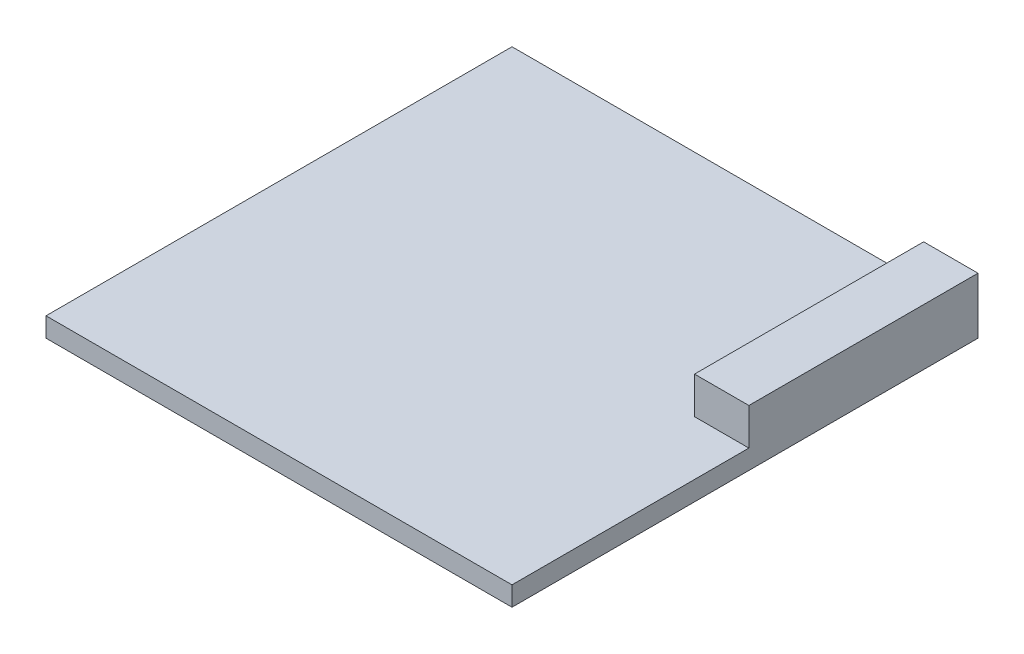
ISO-10303-21;
HEADER;
FILE_DESCRIPTION(('STEP AP214'),'2;1');
FILE_NAME('part.step','',(''),(''),'','','');
FILE_SCHEMA(('AUTOMOTIVE_DESIGN { 1 0 10303 214 1 1 1 1 }'));
ENDSEC;
DATA;
#1=APPLICATION_CONTEXT('core data for automotive mechanical design processes');
#2=APPLICATION_PROTOCOL_DEFINITION('international standard','automotive_design',2000,#1);
#3=PRODUCT_CONTEXT('',#1,'mechanical');
#4=PRODUCT('Part','Part','',(#3));
#5=PRODUCT_RELATED_PRODUCT_CATEGORY('part','',(#4));
#6=PRODUCT_DEFINITION_FORMATION('','',#4);
#7=PRODUCT_DEFINITION_CONTEXT('part definition',#1,'design');
#8=PRODUCT_DEFINITION('design','',#6,#7);
#9=PRODUCT_DEFINITION_SHAPE('','',#8);
#10=(LENGTH_UNIT() NAMED_UNIT(*) SI_UNIT(.MILLI.,.METRE.));
#11=(NAMED_UNIT(*) PLANE_ANGLE_UNIT() SI_UNIT($,.RADIAN.));
#12=(NAMED_UNIT(*) SI_UNIT($,.STERADIAN.) SOLID_ANGLE_UNIT());
#13=UNCERTAINTY_MEASURE_WITH_UNIT(LENGTH_MEASURE(1.E-05),#10,'distance_accuracy_value','');
#14=(GEOMETRIC_REPRESENTATION_CONTEXT(3) GLOBAL_UNCERTAINTY_ASSIGNED_CONTEXT((#13)) GLOBAL_UNIT_ASSIGNED_CONTEXT((#10,
#11,#12)) REPRESENTATION_CONTEXT('',''));
#15=CARTESIAN_POINT('',(0.,0.,0.));
#16=DIRECTION('',(0.,0.,1.));
#17=DIRECTION('',(1.,0.,0.));
#18=AXIS2_PLACEMENT_3D('',#15,#16,#17);
#19=CARTESIAN_POINT('',(-304.8,12.7,304.8));
#20=DIRECTION('',(1.,0.,0.));
#21=DIRECTION('',(0.,0.,-1.));
#22=AXIS2_PLACEMENT_3D('',#19,#20,#21);
#23=PLANE('',#22);
#24=DIRECTION('',(0.,0.,1.));
#25=VECTOR('',#24,1.);
#26=CARTESIAN_POINT('',(-304.8,-12.7,304.8));
#27=LINE('',#26,#25);
#28=CARTESIAN_POINT('',(-304.8,-12.7,-304.8));
#29=VERTEX_POINT('',#28);
#30=CARTESIAN_POINT('',(-304.8,-12.7,304.8));
#31=VERTEX_POINT('',#30);
#32=EDGE_CURVE('E146',#29,#31,#27,.T.);
#33=ORIENTED_EDGE('',*,*,#32,.T.);
#34=DIRECTION('',(0.,-1.,0.));
#35=VECTOR('',#34,1.);
#36=CARTESIAN_POINT('',(-304.8,12.7,304.8));
#37=LINE('',#36,#35);
#38=CARTESIAN_POINT('',(-304.8,12.7,304.8));
#39=VERTEX_POINT('',#38);
#40=EDGE_CURVE('E11',#39,#31,#37,.T.);
#41=ORIENTED_EDGE('',*,*,#40,.F.);
#42=DIRECTION('',(0.,0.,1.));
#43=VECTOR('',#42,1.);
#44=CARTESIAN_POINT('',(-304.8,12.7,304.8));
#45=LINE('',#44,#43);
#46=CARTESIAN_POINT('',(-304.8,12.7,-304.8));
#47=VERTEX_POINT('',#46);
#48=EDGE_CURVE('E147',#47,#39,#45,.T.);
#49=ORIENTED_EDGE('',*,*,#48,.F.);
#50=DIRECTION('',(0.,-1.,0.));
#51=VECTOR('',#50,1.);
#52=CARTESIAN_POINT('',(-304.8,12.7,-304.8));
#53=LINE('',#52,#51);
#54=EDGE_CURVE('E109',#47,#29,#53,.T.);
#55=ORIENTED_EDGE('',*,*,#54,.T.);
#56=EDGE_LOOP('',(#33,#41,#49,#55));
#57=FACE_BOUND('',#56,.T.);
#58=ADVANCED_FACE('F39',(#57),#23,.F.);
#59=CARTESIAN_POINT('',(304.8,12.7,304.8));
#60=DIRECTION('',(0.,0.,-1.));
#61=DIRECTION('',(-1.,0.,0.));
#62=AXIS2_PLACEMENT_3D('',#59,#60,#61);
#63=PLANE('',#62);
#64=DIRECTION('',(1.,0.,0.));
#65=VECTOR('',#64,1.);
#66=CARTESIAN_POINT('',(304.8,-12.7,304.8));
#67=LINE('',#66,#65);
#68=CARTESIAN_POINT('',(304.8,-12.7,304.8));
#69=VERTEX_POINT('',#68);
#70=EDGE_CURVE('E163',#31,#69,#67,.T.);
#71=ORIENTED_EDGE('',*,*,#70,.T.);
#72=DIRECTION('',(0.,-1.,0.));
#73=VECTOR('',#72,1.);
#74=CARTESIAN_POINT('',(304.8,12.7,304.8));
#75=LINE('',#74,#73);
#76=CARTESIAN_POINT('',(304.8,12.7,304.8));
#77=VERTEX_POINT('',#76);
#78=EDGE_CURVE('E47',#77,#69,#75,.T.);
#79=ORIENTED_EDGE('',*,*,#78,.F.);
#80=DIRECTION('',(1.,0.,0.));
#81=VECTOR('',#80,1.);
#82=CARTESIAN_POINT('',(304.8,12.7,304.8));
#83=LINE('',#82,#81);
#84=EDGE_CURVE('E151',#39,#77,#83,.T.);
#85=ORIENTED_EDGE('',*,*,#84,.F.);
#86=ORIENTED_EDGE('',*,*,#40,.T.);
#87=EDGE_LOOP('',(#71,#79,#85,#86));
#88=FACE_BOUND('',#87,.T.);
#89=ADVANCED_FACE('F197',(#88),#63,.F.);
#90=CARTESIAN_POINT('',(304.8,12.7,304.8));
#91=DIRECTION('',(-1.,0.,0.));
#92=DIRECTION('',(0.,0.,1.));
#93=AXIS2_PLACEMENT_3D('',#90,#91,#92);
#94=PLANE('',#93);
#95=DIRECTION('',(0.,0.,-1.));
#96=VECTOR('',#95,1.);
#97=CARTESIAN_POINT('',(304.8,-12.7,304.8));
#98=LINE('',#97,#96);
#99=CARTESIAN_POINT('',(304.8,-12.7,-304.8));
#100=VERTEX_POINT('',#99);
#101=EDGE_CURVE('E105',#69,#100,#98,.T.);
#102=ORIENTED_EDGE('',*,*,#101,.T.);
#103=DIRECTION('',(0.,-1.,0.));
#104=VECTOR('',#103,1.);
#105=CARTESIAN_POINT('',(304.8,12.7,-304.8));
#106=LINE('',#105,#104);
#107=CARTESIAN_POINT('',(304.8,60.96,-304.8));
#108=VERTEX_POINT('',#107);
#109=EDGE_CURVE('E97',#108,#100,#106,.T.);
#110=ORIENTED_EDGE('',*,*,#109,.F.);
#111=DIRECTION('',(0.,0.,-1.));
#112=VECTOR('',#111,1.);
#113=CARTESIAN_POINT('',(304.8,60.96,-304.8));
#114=LINE('',#113,#112);
#115=CARTESIAN_POINT('',(304.8,60.96,-5.08000000000006));
#116=VERTEX_POINT('',#115);
#117=EDGE_CURVE('E102',#116,#108,#114,.T.);
#118=ORIENTED_EDGE('',*,*,#117,.F.);
#119=DIRECTION('',(0.,-1.,0.));
#120=VECTOR('',#119,1.);
#121=CARTESIAN_POINT('',(304.8,60.96,-5.08000000000006));
#122=LINE('',#121,#120);
#123=CARTESIAN_POINT('',(304.8,12.7,-5.08000000000003));
#124=VERTEX_POINT('',#123);
#125=EDGE_CURVE('E135',#116,#124,#122,.T.);
#126=ORIENTED_EDGE('',*,*,#125,.T.);
#127=DIRECTION('',(0.,0.,-1.));
#128=VECTOR('',#127,1.);
#129=CARTESIAN_POINT('',(304.8,12.7,304.8));
#130=LINE('',#129,#128);
#131=EDGE_CURVE('E60',#77,#124,#130,.T.);
#132=ORIENTED_EDGE('',*,*,#131,.F.);
#133=ORIENTED_EDGE('',*,*,#78,.T.);
#134=EDGE_LOOP('',(#102,#110,#118,#126,#132,#133));
#135=FACE_BOUND('',#134,.T.);
#136=ADVANCED_FACE('F99',(#135),#94,.F.);
#137=CARTESIAN_POINT('',(304.8,12.7,-304.8));
#138=DIRECTION('',(0.,0.,1.));
#139=DIRECTION('',(1.,0.,0.));
#140=AXIS2_PLACEMENT_3D('',#137,#138,#139);
#141=PLANE('',#140);
#142=DIRECTION('',(-1.,0.,0.));
#143=VECTOR('',#142,1.);
#144=CARTESIAN_POINT('',(304.8,-12.7,-304.8));
#145=LINE('',#144,#143);
#146=EDGE_CURVE('E152',#100,#29,#145,.T.);
#147=ORIENTED_EDGE('',*,*,#146,.T.);
#148=ORIENTED_EDGE('',*,*,#54,.F.);
#149=DIRECTION('',(-1.,0.,0.));
#150=VECTOR('',#149,1.);
#151=CARTESIAN_POINT('',(304.8,12.7,-304.8));
#152=LINE('',#151,#150);
#153=CARTESIAN_POINT('',(233.68,12.7,-304.8));
#154=VERTEX_POINT('',#153);
#155=EDGE_CURVE('E157',#154,#47,#152,.T.);
#156=ORIENTED_EDGE('',*,*,#155,.F.);
#157=DIRECTION('',(0.,-1.,0.));
#158=VECTOR('',#157,1.);
#159=CARTESIAN_POINT('',(233.68,60.96,-304.8));
#160=LINE('',#159,#158);
#161=CARTESIAN_POINT('',(233.68,60.96,-304.8));
#162=VERTEX_POINT('',#161);
#163=EDGE_CURVE('E115',#162,#154,#160,.T.);
#164=ORIENTED_EDGE('',*,*,#163,.F.);
#165=DIRECTION('',(-1.,0.,0.));
#166=VECTOR('',#165,1.);
#167=CARTESIAN_POINT('',(304.8,60.96,-304.8));
#168=LINE('',#167,#166);
#169=EDGE_CURVE('E112',#108,#162,#168,.T.);
#170=ORIENTED_EDGE('',*,*,#169,.F.);
#171=ORIENTED_EDGE('',*,*,#109,.T.);
#172=EDGE_LOOP('',(#147,#148,#156,#164,#170,#171));
#173=FACE_BOUND('',#172,.T.);
#174=ADVANCED_FACE('F113',(#173),#141,.F.);
#175=CARTESIAN_POINT('',(0.,12.7,0.));
#176=DIRECTION('',(0.,1.,0.));
#177=DIRECTION('',(0.,0.,1.));
#178=AXIS2_PLACEMENT_3D('',#175,#176,#177);
#179=PLANE('',#178);
#180=DIRECTION('',(1.,0.,0.));
#181=VECTOR('',#180,1.);
#182=CARTESIAN_POINT('',(304.8,12.7,-5.08000000000006));
#183=LINE('',#182,#181);
#184=CARTESIAN_POINT('',(233.68,12.7,-5.08000000000005));
#185=VERTEX_POINT('',#184);
#186=EDGE_CURVE('E126',#185,#124,#183,.T.);
#187=ORIENTED_EDGE('',*,*,#186,.F.);
#188=DIRECTION('',(0.,0.,1.));
#189=VECTOR('',#188,1.);
#190=CARTESIAN_POINT('',(233.68,12.7,-304.8));
#191=LINE('',#190,#189);
#192=EDGE_CURVE('E54',#154,#185,#191,.T.);
#193=ORIENTED_EDGE('',*,*,#192,.F.);
#194=ORIENTED_EDGE('',*,*,#155,.T.);
#195=ORIENTED_EDGE('',*,*,#48,.T.);
#196=ORIENTED_EDGE('',*,*,#84,.T.);
#197=ORIENTED_EDGE('',*,*,#131,.T.);
#198=EDGE_LOOP('',(#187,#193,#194,#195,#196,#197));
#199=FACE_BOUND('',#198,.T.);
#200=ADVANCED_FACE('F182',(#199),#179,.T.);
#201=CARTESIAN_POINT('',(0.,-12.7,0.));
#202=DIRECTION('',(0.,1.,0.));
#203=DIRECTION('',(0.,0.,1.));
#204=AXIS2_PLACEMENT_3D('',#201,#202,#203);
#205=PLANE('',#204);
#206=ORIENTED_EDGE('',*,*,#32,.F.);
#207=ORIENTED_EDGE('',*,*,#146,.F.);
#208=ORIENTED_EDGE('',*,*,#101,.F.);
#209=ORIENTED_EDGE('',*,*,#70,.F.);
#210=EDGE_LOOP('',(#206,#207,#208,#209));
#211=FACE_BOUND('',#210,.T.);
#212=ADVANCED_FACE('F177',(#211),#205,.F.);
#213=CARTESIAN_POINT('',(233.68,60.96,-304.8));
#214=DIRECTION('',(1.,0.,0.));
#215=DIRECTION('',(0.,0.,-1.));
#216=AXIS2_PLACEMENT_3D('',#213,#214,#215);
#217=PLANE('',#216);
#218=ORIENTED_EDGE('',*,*,#192,.T.);
#219=DIRECTION('',(0.,-1.,0.));
#220=VECTOR('',#219,1.);
#221=CARTESIAN_POINT('',(233.68,60.96,-5.08000000000005));
#222=LINE('',#221,#220);
#223=CARTESIAN_POINT('',(233.68,60.96,-5.08000000000005));
#224=VERTEX_POINT('',#223);
#225=EDGE_CURVE('E140',#224,#185,#222,.T.);
#226=ORIENTED_EDGE('',*,*,#225,.F.);
#227=DIRECTION('',(0.,0.,1.));
#228=VECTOR('',#227,1.);
#229=CARTESIAN_POINT('',(233.68,60.96,-304.8));
#230=LINE('',#229,#228);
#231=EDGE_CURVE('E119',#162,#224,#230,.T.);
#232=ORIENTED_EDGE('',*,*,#231,.F.);
#233=ORIENTED_EDGE('',*,*,#163,.T.);
#234=EDGE_LOOP('',(#218,#226,#232,#233));
#235=FACE_BOUND('',#234,.T.);
#236=ADVANCED_FACE('F184',(#235),#217,.F.);
#237=CARTESIAN_POINT('',(304.8,60.96,-5.08000000000006));
#238=DIRECTION('',(0.,0.,-1.));
#239=DIRECTION('',(-1.,0.,0.));
#240=AXIS2_PLACEMENT_3D('',#237,#238,#239);
#241=PLANE('',#240);
#242=ORIENTED_EDGE('',*,*,#186,.T.);
#243=ORIENTED_EDGE('',*,*,#125,.F.);
#244=DIRECTION('',(1.,0.,0.));
#245=VECTOR('',#244,1.);
#246=CARTESIAN_POINT('',(304.8,60.96,-5.08000000000006));
#247=LINE('',#246,#245);
#248=EDGE_CURVE('E123',#224,#116,#247,.T.);
#249=ORIENTED_EDGE('',*,*,#248,.F.);
#250=ORIENTED_EDGE('',*,*,#225,.T.);
#251=EDGE_LOOP('',(#242,#243,#249,#250));
#252=FACE_BOUND('',#251,.T.);
#253=ADVANCED_FACE('F187',(#252),#241,.F.);
#254=CARTESIAN_POINT('',(0.,60.96,0.));
#255=DIRECTION('',(0.,-1.,0.));
#256=DIRECTION('',(0.,0.,-1.));
#257=AXIS2_PLACEMENT_3D('',#254,#255,#256);
#258=PLANE('',#257);
#259=ORIENTED_EDGE('',*,*,#117,.T.);
#260=ORIENTED_EDGE('',*,*,#169,.T.);
#261=ORIENTED_EDGE('',*,*,#231,.T.);
#262=ORIENTED_EDGE('',*,*,#248,.T.);
#263=EDGE_LOOP('',(#259,#260,#261,#262));
#264=FACE_BOUND('',#263,.T.);
#265=ADVANCED_FACE('F121',(#264),#258,.F.);
#266=CLOSED_SHELL('',(#58,#89,#136,#174,#200,#212,#236,#253,#265));
#267=MANIFOLD_SOLID_BREP('B2',#266);
#268=ADVANCED_BREP_SHAPE_REPRESENTATION('',(#18,#267),#14);
#269=SHAPE_DEFINITION_REPRESENTATION(#9,#268);
ENDSEC;
END-ISO-10303-21;
